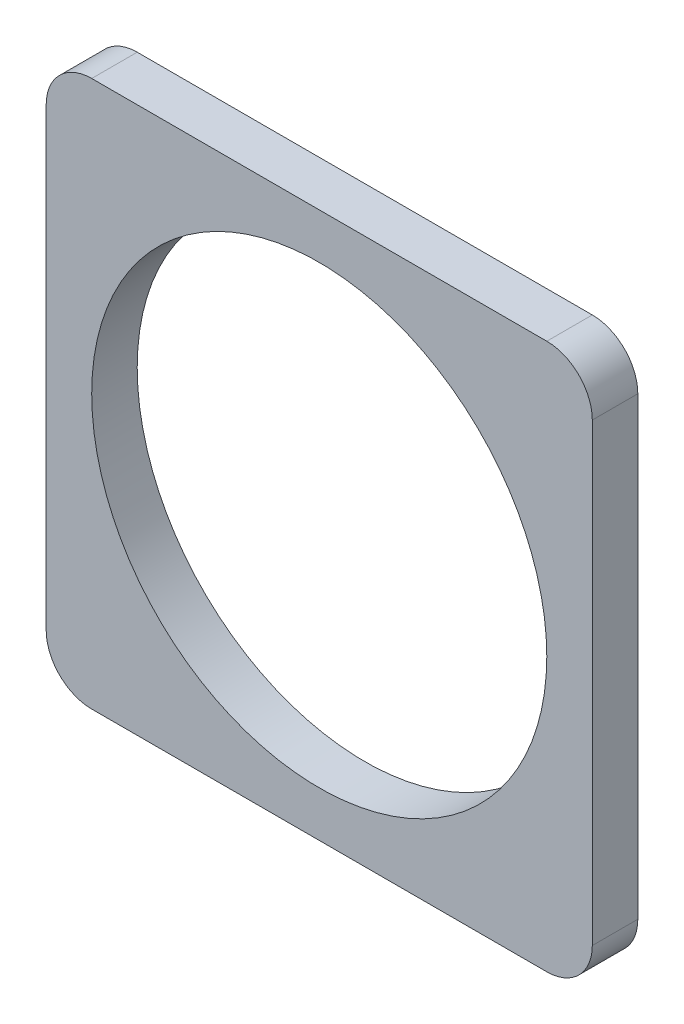
ISO-10303-21;
HEADER;
FILE_DESCRIPTION(('STEP AP214'),'2;1');
FILE_NAME('part.step','',(''),(''),'','','');
FILE_SCHEMA(('AUTOMOTIVE_DESIGN { 1 0 10303 214 1 1 1 1 }'));
ENDSEC;
DATA;
#1=APPLICATION_CONTEXT('core data for automotive mechanical design processes');
#2=APPLICATION_PROTOCOL_DEFINITION('international standard','automotive_design',2000,#1);
#3=PRODUCT_CONTEXT('',#1,'mechanical');
#4=PRODUCT('Part','Part','',(#3));
#5=PRODUCT_RELATED_PRODUCT_CATEGORY('part','',(#4));
#6=PRODUCT_DEFINITION_FORMATION('','',#4);
#7=PRODUCT_DEFINITION_CONTEXT('part definition',#1,'design');
#8=PRODUCT_DEFINITION('design','',#6,#7);
#9=PRODUCT_DEFINITION_SHAPE('','',#8);
#10=(LENGTH_UNIT() NAMED_UNIT(*) SI_UNIT(.MILLI.,.METRE.));
#11=(NAMED_UNIT(*) PLANE_ANGLE_UNIT() SI_UNIT($,.RADIAN.));
#12=(NAMED_UNIT(*) SI_UNIT($,.STERADIAN.) SOLID_ANGLE_UNIT());
#13=UNCERTAINTY_MEASURE_WITH_UNIT(LENGTH_MEASURE(1.E-05),#10,'distance_accuracy_value','');
#14=(GEOMETRIC_REPRESENTATION_CONTEXT(3) GLOBAL_UNCERTAINTY_ASSIGNED_CONTEXT((#13)) GLOBAL_UNIT_ASSIGNED_CONTEXT((#10,
#11,#12)) REPRESENTATION_CONTEXT('',''));
#15=CARTESIAN_POINT('',(0.,0.,0.));
#16=DIRECTION('',(0.,0.,1.));
#17=DIRECTION('',(1.,0.,0.));
#18=AXIS2_PLACEMENT_3D('',#15,#16,#17);
#19=CARTESIAN_POINT('',(-49.9999999999999,60.,10.));
#20=DIRECTION('',(0.,1.,0.));
#21=DIRECTION('',(0.,0.,1.));
#22=AXIS2_PLACEMENT_3D('',#19,#20,#21);
#23=PLANE('',#22);
#24=DIRECTION('',(1.,0.,0.));
#25=VECTOR('',#24,1.);
#26=CARTESIAN_POINT('',(-49.9999999999999,60.,0.));
#27=LINE('',#26,#25);
#28=CARTESIAN_POINT('',(-49.9999999999999,60.,0.));
#29=VERTEX_POINT('',#28);
#30=CARTESIAN_POINT('',(49.9999999999999,60.,0.));
#31=VERTEX_POINT('',#30);
#32=EDGE_CURVE('E131',#29,#31,#27,.T.);
#33=ORIENTED_EDGE('',*,*,#32,.F.);
#34=DIRECTION('',(0.,0.,-1.));
#35=VECTOR('',#34,1.);
#36=CARTESIAN_POINT('',(-49.9999999999999,60.,10.));
#37=LINE('',#36,#35);
#38=CARTESIAN_POINT('',(-49.9999999999999,60.,10.));
#39=VERTEX_POINT('',#38);
#40=EDGE_CURVE('E11',#39,#29,#37,.T.);
#41=ORIENTED_EDGE('',*,*,#40,.F.);
#42=DIRECTION('',(1.,0.,0.));
#43=VECTOR('',#42,1.);
#44=CARTESIAN_POINT('',(-49.9999999999999,60.,10.));
#45=LINE('',#44,#43);
#46=CARTESIAN_POINT('',(49.9999999999999,60.,10.));
#47=VERTEX_POINT('',#46);
#48=EDGE_CURVE('E149',#39,#47,#45,.T.);
#49=ORIENTED_EDGE('',*,*,#48,.T.);
#50=DIRECTION('',(0.,0.,-1.));
#51=VECTOR('',#50,1.);
#52=CARTESIAN_POINT('',(49.9999999999999,60.,10.));
#53=LINE('',#52,#51);
#54=EDGE_CURVE('E36',#47,#31,#53,.T.);
#55=ORIENTED_EDGE('',*,*,#54,.T.);
#56=EDGE_LOOP('',(#33,#41,#49,#55));
#57=FACE_BOUND('',#56,.T.);
#58=ADVANCED_FACE('F33',(#57),#23,.T.);
#59=CARTESIAN_POINT('',(-50.,50.,10.));
#60=DIRECTION('',(0.,0.,-1.));
#61=DIRECTION('',(-1.,0.,0.));
#62=AXIS2_PLACEMENT_3D('',#59,#60,#61);
#63=CYLINDRICAL_SURFACE('',#62,10.);
#64=CARTESIAN_POINT('',(-50.,50.,0.));
#65=DIRECTION('',(0.,0.,1.));
#66=DIRECTION('',(1.,0.,0.));
#67=AXIS2_PLACEMENT_3D('',#64,#65,#66);
#68=CIRCLE('',#67,10.);
#69=CARTESIAN_POINT('',(-60.,49.9999999999999,0.));
#70=VERTEX_POINT('',#69);
#71=EDGE_CURVE('E78',#29,#70,#68,.T.);
#72=ORIENTED_EDGE('',*,*,#71,.T.);
#73=DIRECTION('',(0.,0.,-1.));
#74=VECTOR('',#73,1.);
#75=CARTESIAN_POINT('',(-60.,49.9999999999999,10.));
#76=LINE('',#75,#74);
#77=CARTESIAN_POINT('',(-60.,49.9999999999999,10.));
#78=VERTEX_POINT('',#77);
#79=EDGE_CURVE('E42',#78,#70,#76,.T.);
#80=ORIENTED_EDGE('',*,*,#79,.F.);
#81=CARTESIAN_POINT('',(-50.,50.,10.));
#82=DIRECTION('',(0.,0.,1.));
#83=DIRECTION('',(1.,0.,0.));
#84=AXIS2_PLACEMENT_3D('',#81,#82,#83);
#85=CIRCLE('',#84,10.);
#86=EDGE_CURVE('E109',#39,#78,#85,.T.);
#87=ORIENTED_EDGE('',*,*,#86,.F.);
#88=ORIENTED_EDGE('',*,*,#40,.T.);
#89=EDGE_LOOP('',(#72,#80,#87,#88));
#90=FACE_BOUND('',#89,.T.);
#91=ADVANCED_FACE('F202',(#90),#63,.T.);
#92=CARTESIAN_POINT('',(-60.,49.9999999999999,10.));
#93=DIRECTION('',(1.,0.,0.));
#94=DIRECTION('',(0.,1.,0.));
#95=AXIS2_PLACEMENT_3D('',#92,#93,#94);
#96=PLANE('',#95);
#97=DIRECTION('',(0.,-1.,0.));
#98=VECTOR('',#97,1.);
#99=CARTESIAN_POINT('',(-60.,49.9999999999999,0.));
#100=LINE('',#99,#98);
#101=CARTESIAN_POINT('',(-60.,-49.9999999999999,0.));
#102=VERTEX_POINT('',#101);
#103=EDGE_CURVE('E116',#70,#102,#100,.T.);
#104=ORIENTED_EDGE('',*,*,#103,.T.);
#105=DIRECTION('',(0.,0.,-1.));
#106=VECTOR('',#105,1.);
#107=CARTESIAN_POINT('',(-60.,-49.9999999999999,10.));
#108=LINE('',#107,#106);
#109=CARTESIAN_POINT('',(-60.,-49.9999999999999,10.));
#110=VERTEX_POINT('',#109);
#111=EDGE_CURVE('E113',#110,#102,#108,.T.);
#112=ORIENTED_EDGE('',*,*,#111,.F.);
#113=DIRECTION('',(0.,-1.,0.));
#114=VECTOR('',#113,1.);
#115=CARTESIAN_POINT('',(-60.,49.9999999999999,10.));
#116=LINE('',#115,#114);
#117=EDGE_CURVE('E102',#78,#110,#116,.T.);
#118=ORIENTED_EDGE('',*,*,#117,.F.);
#119=ORIENTED_EDGE('',*,*,#79,.T.);
#120=EDGE_LOOP('',(#104,#112,#118,#119));
#121=FACE_BOUND('',#120,.T.);
#122=ADVANCED_FACE('F114',(#121),#96,.F.);
#123=CARTESIAN_POINT('',(-50.,-50.,10.));
#124=DIRECTION('',(0.,0.,-1.));
#125=DIRECTION('',(-1.,0.,0.));
#126=AXIS2_PLACEMENT_3D('',#123,#124,#125);
#127=CYLINDRICAL_SURFACE('',#126,10.);
#128=CARTESIAN_POINT('',(-50.,-50.,0.));
#129=DIRECTION('',(0.,0.,1.));
#130=DIRECTION('',(1.,0.,0.));
#131=AXIS2_PLACEMENT_3D('',#128,#129,#130);
#132=CIRCLE('',#131,10.);
#133=CARTESIAN_POINT('',(-49.9999999999999,-60.,0.));
#134=VERTEX_POINT('',#133);
#135=EDGE_CURVE('E146',#102,#134,#132,.T.);
#136=ORIENTED_EDGE('',*,*,#135,.T.);
#137=DIRECTION('',(0.,0.,-1.));
#138=VECTOR('',#137,1.);
#139=CARTESIAN_POINT('',(-49.9999999999999,-60.,10.));
#140=LINE('',#139,#138);
#141=CARTESIAN_POINT('',(-49.9999999999999,-60.,10.));
#142=VERTEX_POINT('',#141);
#143=EDGE_CURVE('E119',#142,#134,#140,.T.);
#144=ORIENTED_EDGE('',*,*,#143,.F.);
#145=CARTESIAN_POINT('',(-50.,-50.,10.));
#146=DIRECTION('',(0.,0.,1.));
#147=DIRECTION('',(1.,0.,0.));
#148=AXIS2_PLACEMENT_3D('',#145,#146,#147);
#149=CIRCLE('',#148,10.);
#150=EDGE_CURVE('E107',#110,#142,#149,.T.);
#151=ORIENTED_EDGE('',*,*,#150,.F.);
#152=ORIENTED_EDGE('',*,*,#111,.T.);
#153=EDGE_LOOP('',(#136,#144,#151,#152));
#154=FACE_BOUND('',#153,.T.);
#155=ADVANCED_FACE('F121',(#154),#127,.T.);
#156=CARTESIAN_POINT('',(-49.9999999999999,-60.,10.));
#157=DIRECTION('',(0.,1.,0.));
#158=DIRECTION('',(0.,0.,1.));
#159=AXIS2_PLACEMENT_3D('',#156,#157,#158);
#160=PLANE('',#159);
#161=DIRECTION('',(1.,0.,0.));
#162=VECTOR('',#161,1.);
#163=CARTESIAN_POINT('',(-49.9999999999999,-60.,0.));
#164=LINE('',#163,#162);
#165=CARTESIAN_POINT('',(49.9999999999999,-60.,0.));
#166=VERTEX_POINT('',#165);
#167=EDGE_CURVE('E144',#134,#166,#164,.T.);
#168=ORIENTED_EDGE('',*,*,#167,.T.);
#169=DIRECTION('',(0.,0.,-1.));
#170=VECTOR('',#169,1.);
#171=CARTESIAN_POINT('',(49.9999999999999,-60.,10.));
#172=LINE('',#171,#170);
#173=CARTESIAN_POINT('',(49.9999999999999,-60.,10.));
#174=VERTEX_POINT('',#173);
#175=EDGE_CURVE('E153',#174,#166,#172,.T.);
#176=ORIENTED_EDGE('',*,*,#175,.F.);
#177=DIRECTION('',(1.,0.,0.));
#178=VECTOR('',#177,1.);
#179=CARTESIAN_POINT('',(-49.9999999999999,-60.,10.));
#180=LINE('',#179,#178);
#181=EDGE_CURVE('E124',#142,#174,#180,.T.);
#182=ORIENTED_EDGE('',*,*,#181,.F.);
#183=ORIENTED_EDGE('',*,*,#143,.T.);
#184=EDGE_LOOP('',(#168,#176,#182,#183));
#185=FACE_BOUND('',#184,.T.);
#186=ADVANCED_FACE('F165',(#185),#160,.F.);
#187=CARTESIAN_POINT('',(50.,-50.,10.));
#188=DIRECTION('',(0.,0.,-1.));
#189=DIRECTION('',(-1.,0.,0.));
#190=AXIS2_PLACEMENT_3D('',#187,#188,#189);
#191=CYLINDRICAL_SURFACE('',#190,10.);
#192=CARTESIAN_POINT('',(50.,-50.,0.));
#193=DIRECTION('',(0.,0.,1.));
#194=DIRECTION('',(1.,0.,0.));
#195=AXIS2_PLACEMENT_3D('',#192,#193,#194);
#196=CIRCLE('',#195,10.);
#197=CARTESIAN_POINT('',(60.,-50.,0.));
#198=VERTEX_POINT('',#197);
#199=EDGE_CURVE('E141',#166,#198,#196,.T.);
#200=ORIENTED_EDGE('',*,*,#199,.T.);
#201=DIRECTION('',(0.,0.,-1.));
#202=VECTOR('',#201,1.);
#203=CARTESIAN_POINT('',(60.,-50.,10.));
#204=LINE('',#203,#202);
#205=CARTESIAN_POINT('',(60.,-50.,10.));
#206=VERTEX_POINT('',#205);
#207=EDGE_CURVE('E156',#206,#198,#204,.T.);
#208=ORIENTED_EDGE('',*,*,#207,.F.);
#209=CARTESIAN_POINT('',(50.,-50.,10.));
#210=DIRECTION('',(0.,0.,1.));
#211=DIRECTION('',(1.,0.,0.));
#212=AXIS2_PLACEMENT_3D('',#209,#210,#211);
#213=CIRCLE('',#212,10.);
#214=EDGE_CURVE('E126',#174,#206,#213,.T.);
#215=ORIENTED_EDGE('',*,*,#214,.F.);
#216=ORIENTED_EDGE('',*,*,#175,.T.);
#217=EDGE_LOOP('',(#200,#208,#215,#216));
#218=FACE_BOUND('',#217,.T.);
#219=ADVANCED_FACE('F173',(#218),#191,.T.);
#220=CARTESIAN_POINT('',(60.,49.9999999999999,10.));
#221=DIRECTION('',(1.,0.,0.));
#222=DIRECTION('',(0.,1.,0.));
#223=AXIS2_PLACEMENT_3D('',#220,#221,#222);
#224=PLANE('',#223);
#225=DIRECTION('',(0.,-1.,0.));
#226=VECTOR('',#225,1.);
#227=CARTESIAN_POINT('',(60.,49.9999999999999,0.));
#228=LINE('',#227,#226);
#229=CARTESIAN_POINT('',(60.,49.9999999999999,0.));
#230=VERTEX_POINT('',#229);
#231=EDGE_CURVE('E138',#230,#198,#228,.T.);
#232=ORIENTED_EDGE('',*,*,#231,.F.);
#233=DIRECTION('',(0.,0.,-1.));
#234=VECTOR('',#233,1.);
#235=CARTESIAN_POINT('',(60.,49.9999999999999,10.));
#236=LINE('',#235,#234);
#237=CARTESIAN_POINT('',(60.,49.9999999999999,10.));
#238=VERTEX_POINT('',#237);
#239=EDGE_CURVE('E157',#238,#230,#236,.T.);
#240=ORIENTED_EDGE('',*,*,#239,.F.);
#241=DIRECTION('',(0.,-1.,0.));
#242=VECTOR('',#241,1.);
#243=CARTESIAN_POINT('',(60.,49.9999999999999,10.));
#244=LINE('',#243,#242);
#245=EDGE_CURVE('E171',#238,#206,#244,.T.);
#246=ORIENTED_EDGE('',*,*,#245,.T.);
#247=ORIENTED_EDGE('',*,*,#207,.T.);
#248=EDGE_LOOP('',(#232,#240,#246,#247));
#249=FACE_BOUND('',#248,.T.);
#250=ADVANCED_FACE('F175',(#249),#224,.T.);
#251=CARTESIAN_POINT('',(50.,50.,10.));
#252=DIRECTION('',(0.,0.,-1.));
#253=DIRECTION('',(-1.,0.,0.));
#254=AXIS2_PLACEMENT_3D('',#251,#252,#253);
#255=CYLINDRICAL_SURFACE('',#254,10.);
#256=CARTESIAN_POINT('',(50.,50.,0.));
#257=DIRECTION('',(0.,0.,-1.));
#258=DIRECTION('',(-1.,0.,0.));
#259=AXIS2_PLACEMENT_3D('',#256,#257,#258);
#260=CIRCLE('',#259,10.);
#261=EDGE_CURVE('E134',#31,#230,#260,.T.);
#262=ORIENTED_EDGE('',*,*,#261,.F.);
#263=ORIENTED_EDGE('',*,*,#54,.F.);
#264=CARTESIAN_POINT('',(50.,50.,10.));
#265=DIRECTION('',(0.,0.,-1.));
#266=DIRECTION('',(-1.,0.,0.));
#267=AXIS2_PLACEMENT_3D('',#264,#265,#266);
#268=CIRCLE('',#267,10.);
#269=EDGE_CURVE('E176',#47,#238,#268,.T.);
#270=ORIENTED_EDGE('',*,*,#269,.T.);
#271=ORIENTED_EDGE('',*,*,#239,.T.);
#272=EDGE_LOOP('',(#262,#263,#270,#271));
#273=FACE_BOUND('',#272,.T.);
#274=ADVANCED_FACE('F159',(#273),#255,.T.);
#275=CARTESIAN_POINT('',(50.,50.,10.));
#276=DIRECTION('',(0.,0.,-1.));
#277=DIRECTION('',(-1.,0.,0.));
#278=AXIS2_PLACEMENT_3D('',#275,#276,#277);
#279=PLANE('',#278);
#280=CARTESIAN_POINT('',(0.,0.,10.));
#281=DIRECTION('',(0.,0.,1.));
#282=DIRECTION('',(1.,0.,0.));
#283=AXIS2_PLACEMENT_3D('',#280,#281,#282);
#284=CIRCLE('',#283,50.);
#285=CARTESIAN_POINT('',(50.,0.,10.));
#286=VERTEX_POINT('',#285);
#287=EDGE_CURVE('E181',#286,#286,#284,.T.);
#288=ORIENTED_EDGE('',*,*,#287,.F.);
#289=EDGE_LOOP('',(#288));
#290=FACE_BOUND('',#289,.T.);
#291=ORIENTED_EDGE('',*,*,#48,.F.);
#292=ORIENTED_EDGE('',*,*,#86,.T.);
#293=ORIENTED_EDGE('',*,*,#117,.T.);
#294=ORIENTED_EDGE('',*,*,#150,.T.);
#295=ORIENTED_EDGE('',*,*,#181,.T.);
#296=ORIENTED_EDGE('',*,*,#214,.T.);
#297=ORIENTED_EDGE('',*,*,#245,.F.);
#298=ORIENTED_EDGE('',*,*,#269,.F.);
#299=EDGE_LOOP('',(#291,#292,#293,#294,#295,#296,#297,#298));
#300=FACE_BOUND('',#299,.T.);
#301=ADVANCED_FACE('F105',(#290,#300),#279,.F.);
#302=CARTESIAN_POINT('',(50.,50.,0.));
#303=DIRECTION('',(0.,0.,-1.));
#304=DIRECTION('',(-1.,0.,0.));
#305=AXIS2_PLACEMENT_3D('',#302,#303,#304);
#306=PLANE('',#305);
#307=CARTESIAN_POINT('',(0.,0.,0.));
#308=DIRECTION('',(0.,0.,1.));
#309=DIRECTION('',(1.,0.,0.));
#310=AXIS2_PLACEMENT_3D('',#307,#308,#309);
#311=CIRCLE('',#310,50.);
#312=CARTESIAN_POINT('',(50.,0.,0.));
#313=VERTEX_POINT('',#312);
#314=EDGE_CURVE('E135',#313,#313,#311,.T.);
#315=ORIENTED_EDGE('',*,*,#314,.T.);
#316=EDGE_LOOP('',(#315));
#317=FACE_BOUND('',#316,.T.);
#318=ORIENTED_EDGE('',*,*,#32,.T.);
#319=ORIENTED_EDGE('',*,*,#261,.T.);
#320=ORIENTED_EDGE('',*,*,#231,.T.);
#321=ORIENTED_EDGE('',*,*,#199,.F.);
#322=ORIENTED_EDGE('',*,*,#167,.F.);
#323=ORIENTED_EDGE('',*,*,#135,.F.);
#324=ORIENTED_EDGE('',*,*,#103,.F.);
#325=ORIENTED_EDGE('',*,*,#71,.F.);
#326=EDGE_LOOP('',(#318,#319,#320,#321,#322,#323,#324,#325));
#327=FACE_BOUND('',#326,.T.);
#328=ADVANCED_FACE('F161',(#317,#327),#306,.T.);
#329=CARTESIAN_POINT('',(0.,0.,0.));
#330=DIRECTION('',(0.,0.,1.));
#331=DIRECTION('',(1.,0.,0.));
#332=AXIS2_PLACEMENT_3D('',#329,#330,#331);
#333=CYLINDRICAL_SURFACE('',#332,50.);
#334=ORIENTED_EDGE('',*,*,#314,.F.);
#335=EDGE_LOOP('',(#334));
#336=FACE_BOUND('',#335,.T.);
#337=ORIENTED_EDGE('',*,*,#287,.T.);
#338=EDGE_LOOP('',(#337));
#339=FACE_BOUND('',#338,.T.);
#340=ADVANCED_FACE('F188',(#336,#339),#333,.F.);
#341=CLOSED_SHELL('',(#58,#91,#122,#155,#186,#219,#250,#274,#301,#328,#340));
#342=MANIFOLD_SOLID_BREP('B2',#341);
#343=ADVANCED_BREP_SHAPE_REPRESENTATION('',(#18,#342),#14);
#344=SHAPE_DEFINITION_REPRESENTATION(#9,#343);
ENDSEC;
END-ISO-10303-21;
